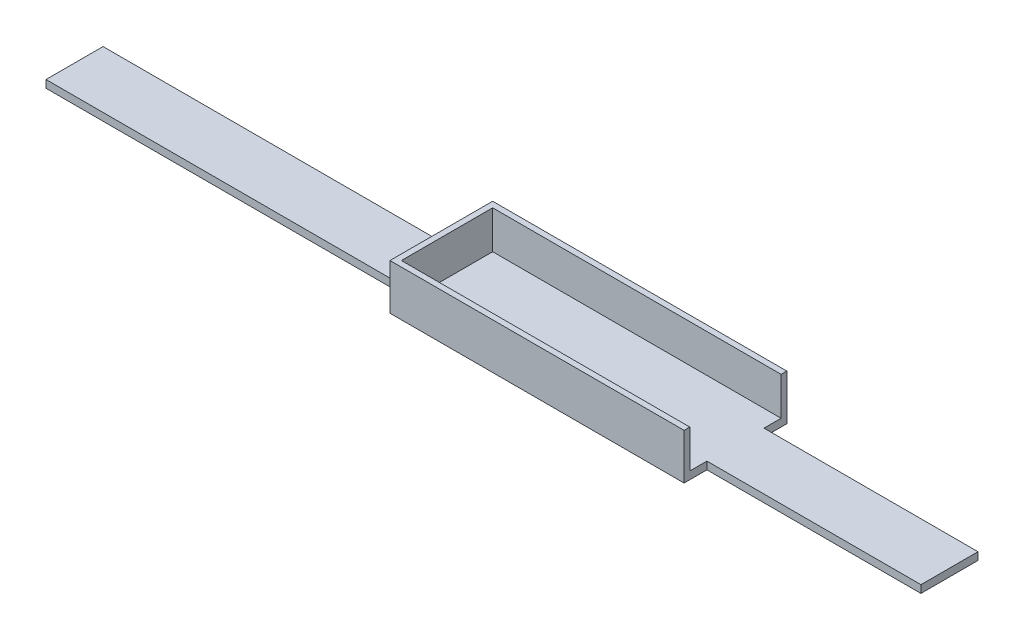
ISO-10303-21;
HEADER;
FILE_DESCRIPTION(('STEP AP214'),'2;1');
FILE_NAME('part.step','',(''),(''),'','','');
FILE_SCHEMA(('AUTOMOTIVE_DESIGN { 1 0 10303 214 1 1 1 1 }'));
ENDSEC;
DATA;
#1=APPLICATION_CONTEXT('core data for automotive mechanical design processes');
#2=APPLICATION_PROTOCOL_DEFINITION('international standard','automotive_design',2000,#1);
#3=PRODUCT_CONTEXT('',#1,'mechanical');
#4=PRODUCT('Part','Part','',(#3));
#5=PRODUCT_RELATED_PRODUCT_CATEGORY('part','',(#4));
#6=PRODUCT_DEFINITION_FORMATION('','',#4);
#7=PRODUCT_DEFINITION_CONTEXT('part definition',#1,'design');
#8=PRODUCT_DEFINITION('design','',#6,#7);
#9=PRODUCT_DEFINITION_SHAPE('','',#8);
#10=(LENGTH_UNIT() NAMED_UNIT(*) SI_UNIT(.MILLI.,.METRE.));
#11=(NAMED_UNIT(*) PLANE_ANGLE_UNIT() SI_UNIT($,.RADIAN.));
#12=(NAMED_UNIT(*) SI_UNIT($,.STERADIAN.) SOLID_ANGLE_UNIT());
#13=UNCERTAINTY_MEASURE_WITH_UNIT(LENGTH_MEASURE(1.E-05),#10,'distance_accuracy_value','');
#14=(GEOMETRIC_REPRESENTATION_CONTEXT(3) GLOBAL_UNCERTAINTY_ASSIGNED_CONTEXT((#13)) GLOBAL_UNIT_ASSIGNED_CONTEXT((#10,
#11,#12)) REPRESENTATION_CONTEXT('',''));
#15=CARTESIAN_POINT('',(0.,0.,0.));
#16=DIRECTION('',(0.,0.,1.));
#17=DIRECTION('',(1.,0.,0.));
#18=AXIS2_PLACEMENT_3D('',#15,#16,#17);
#19=CARTESIAN_POINT('',(0.,2.,0.));
#20=DIRECTION('',(0.,1.,0.));
#21=DIRECTION('',(0.,0.,1.));
#22=AXIS2_PLACEMENT_3D('',#19,#20,#21);
#23=PLANE('',#22);
#24=DIRECTION('',(1.,0.,0.));
#25=VECTOR('',#24,1.);
#26=CARTESIAN_POINT('',(-115.,2.,2.75224215246635));
#27=LINE('',#26,#25);
#28=CARTESIAN_POINT('',(-115.,2.,2.75224215246635));
#29=VERTEX_POINT('',#28);
#30=CARTESIAN_POINT('',(-18.5823533598814,2.,2.75224215246639));
#31=VERTEX_POINT('',#30);
#32=EDGE_CURVE('E174',#29,#31,#27,.T.);
#33=ORIENTED_EDGE('',*,*,#32,.T.);
#34=DIRECTION('',(0.,0.,1.));
#35=VECTOR('',#34,1.);
#36=CARTESIAN_POINT('',(-18.5823533598814,2.,-18.2477578475336));
#37=LINE('',#36,#35);
#38=CARTESIAN_POINT('',(-18.5823533598814,2.,-12.2477578475336));
#39=VERTEX_POINT('',#38);
#40=EDGE_CURVE('E256',#39,#31,#37,.T.);
#41=ORIENTED_EDGE('',*,*,#40,.F.);
#42=DIRECTION('',(-1.,0.,0.));
#43=VECTOR('',#42,1.);
#44=CARTESIAN_POINT('',(-115.,2.,-12.2477578475336));
#45=LINE('',#44,#43);
#46=CARTESIAN_POINT('',(-115.,2.,-12.2477578475336));
#47=VERTEX_POINT('',#46);
#48=EDGE_CURVE('E186',#39,#47,#45,.T.);
#49=ORIENTED_EDGE('',*,*,#48,.T.);
#50=DIRECTION('',(0.,0.,1.));
#51=VECTOR('',#50,1.);
#52=CARTESIAN_POINT('',(-115.,2.,-12.2477578475336));
#53=LINE('',#52,#51);
#54=EDGE_CURVE('E197',#47,#29,#53,.T.);
#55=ORIENTED_EDGE('',*,*,#54,.T.);
#56=EDGE_LOOP('',(#33,#41,#49,#55));
#57=FACE_BOUND('',#56,.T.);
#58=ADVANCED_FACE('F39',(#57),#23,.T.);
#59=DIRECTION('',(0.,0.,-1.));
#60=VECTOR('',#59,1.);
#61=CARTESIAN_POINT('',(-17.0823533598814,2.,7.25224215246636));
#62=LINE('',#61,#60);
#63=CARTESIAN_POINT('',(-17.0823533598814,2.,7.25224215246636));
#64=VERTEX_POINT('',#63);
#65=CARTESIAN_POINT('',(-17.0823533598814,2.,-16.7477578475336));
#66=VERTEX_POINT('',#65);
#67=EDGE_CURVE('E259',#64,#66,#62,.T.);
#68=ORIENTED_EDGE('',*,*,#67,.F.);
#69=DIRECTION('',(-1.,0.,0.));
#70=VECTOR('',#69,1.);
#71=CARTESIAN_POINT('',(58.7427130834762,2.,7.25224215246635));
#72=LINE('',#71,#70);
#73=CARTESIAN_POINT('',(58.7427130834762,2.,7.25224215246635));
#74=VERTEX_POINT('',#73);
#75=EDGE_CURVE('E257',#74,#64,#72,.T.);
#76=ORIENTED_EDGE('',*,*,#75,.F.);
#77=DIRECTION('',(0.,0.,-1.));
#78=VECTOR('',#77,1.);
#79=CARTESIAN_POINT('',(58.7427130834762,2.,92.1031691053456));
#80=LINE('',#79,#78);
#81=CARTESIAN_POINT('',(58.7427130834762,2.,2.75224215246639));
#82=VERTEX_POINT('',#81);
#83=EDGE_CURVE('E233',#74,#82,#80,.T.);
#84=ORIENTED_EDGE('',*,*,#83,.T.);
#85=CARTESIAN_POINT('',(115.,2.,2.75224215246635));
#86=VERTEX_POINT('',#85);
#87=EDGE_CURVE('E193',#82,#86,#27,.T.);
#88=ORIENTED_EDGE('',*,*,#87,.T.);
#89=DIRECTION('',(0.,0.,-1.));
#90=VECTOR('',#89,1.);
#91=CARTESIAN_POINT('',(115.,2.,-12.2477578475336));
#92=LINE('',#91,#90);
#93=CARTESIAN_POINT('',(115.,2.,-12.2477578475336));
#94=VERTEX_POINT('',#93);
#95=EDGE_CURVE('E183',#86,#94,#92,.T.);
#96=ORIENTED_EDGE('',*,*,#95,.T.);
#97=CARTESIAN_POINT('',(58.7427130834762,2.,-12.2477578475336));
#98=VERTEX_POINT('',#97);
#99=EDGE_CURVE('E251',#94,#98,#45,.T.);
#100=ORIENTED_EDGE('',*,*,#99,.T.);
#101=CARTESIAN_POINT('',(58.7427130834762,2.,-16.7477578475336));
#102=VERTEX_POINT('',#101);
#103=EDGE_CURVE('E54',#98,#102,#80,.T.);
#104=ORIENTED_EDGE('',*,*,#103,.T.);
#105=DIRECTION('',(1.,0.,0.));
#106=VECTOR('',#105,1.);
#107=CARTESIAN_POINT('',(-17.0823533598814,2.,-16.7477578475336));
#108=LINE('',#107,#106);
#109=EDGE_CURVE('E266',#66,#102,#108,.T.);
#110=ORIENTED_EDGE('',*,*,#109,.F.);
#111=EDGE_LOOP('',(#68,#76,#84,#88,#96,#100,#104,#110));
#112=FACE_BOUND('',#111,.T.);
#113=ADVANCED_FACE('F288',(#112),#23,.T.);
#114=CARTESIAN_POINT('',(-115.,2.,-12.2477578475336));
#115=DIRECTION('',(0.,0.,1.));
#116=DIRECTION('',(1.,0.,0.));
#117=AXIS2_PLACEMENT_3D('',#114,#115,#116);
#118=PLANE('',#117);
#119=ORIENTED_EDGE('',*,*,#48,.F.);
#120=DIRECTION('',(0.,-1.,0.));
#121=VECTOR('',#120,1.);
#122=CARTESIAN_POINT('',(-18.5823533598814,2.,-12.2477578475336));
#123=LINE('',#122,#121);
#124=CARTESIAN_POINT('',(-18.5823533598814,0.,-12.2477578475336));
#125=VERTEX_POINT('',#124);
#126=EDGE_CURVE('E203',#39,#125,#123,.T.);
#127=ORIENTED_EDGE('',*,*,#126,.T.);
#128=DIRECTION('',(-1.,0.,0.));
#129=VECTOR('',#128,1.);
#130=CARTESIAN_POINT('',(-115.,0.,-12.2477578475336));
#131=LINE('',#130,#129);
#132=CARTESIAN_POINT('',(-115.,0.,-12.2477578475336));
#133=VERTEX_POINT('',#132);
#134=EDGE_CURVE('E202',#125,#133,#131,.T.);
#135=ORIENTED_EDGE('',*,*,#134,.T.);
#136=DIRECTION('',(0.,-1.,0.));
#137=VECTOR('',#136,1.);
#138=CARTESIAN_POINT('',(-115.,2.,-12.2477578475336));
#139=LINE('',#138,#137);
#140=EDGE_CURVE('E47',#47,#133,#139,.T.);
#141=ORIENTED_EDGE('',*,*,#140,.F.);
#142=EDGE_LOOP('',(#119,#127,#135,#141));
#143=FACE_BOUND('',#142,.T.);
#144=ADVANCED_FACE('F210',(#143),#118,.F.);
#145=CARTESIAN_POINT('',(-115.,2.,2.75224215246635));
#146=DIRECTION('',(0.,0.,-1.));
#147=DIRECTION('',(-1.,0.,0.));
#148=AXIS2_PLACEMENT_3D('',#145,#146,#147);
#149=PLANE('',#148);
#150=DIRECTION('',(1.,0.,0.));
#151=VECTOR('',#150,1.);
#152=CARTESIAN_POINT('',(-115.,0.,2.75224215246635));
#153=LINE('',#152,#151);
#154=CARTESIAN_POINT('',(-115.,0.,2.75224215246635));
#155=VERTEX_POINT('',#154);
#156=CARTESIAN_POINT('',(-18.5823533598814,0.,2.75224215246639));
#157=VERTEX_POINT('',#156);
#158=EDGE_CURVE('E172',#155,#157,#153,.T.);
#159=ORIENTED_EDGE('',*,*,#158,.T.);
#160=DIRECTION('',(0.,1.,0.));
#161=VECTOR('',#160,1.);
#162=CARTESIAN_POINT('',(-18.5823533598814,2.,2.75224215246635));
#163=LINE('',#162,#161);
#164=EDGE_CURVE('E249',#157,#31,#163,.T.);
#165=ORIENTED_EDGE('',*,*,#164,.T.);
#166=ORIENTED_EDGE('',*,*,#32,.F.);
#167=DIRECTION('',(0.,-1.,0.));
#168=VECTOR('',#167,1.);
#169=CARTESIAN_POINT('',(-115.,2.,2.75224215246635));
#170=LINE('',#169,#168);
#171=EDGE_CURVE('E157',#29,#155,#170,.T.);
#172=ORIENTED_EDGE('',*,*,#171,.T.);
#173=EDGE_LOOP('',(#159,#165,#166,#172));
#174=FACE_BOUND('',#173,.T.);
#175=ADVANCED_FACE('F170',(#174),#149,.F.);
#176=CARTESIAN_POINT('',(115.,0.,-12.2477578475336));
#177=VERTEX_POINT('',#176);
#178=CARTESIAN_POINT('',(58.7427130834761,0.,-12.2477578475336));
#179=VERTEX_POINT('',#178);
#180=EDGE_CURVE('E165',#177,#179,#131,.T.);
#181=ORIENTED_EDGE('',*,*,#180,.T.);
#182=DIRECTION('',(0.,1.,0.));
#183=VECTOR('',#182,1.);
#184=CARTESIAN_POINT('',(58.7427130834762,1.9999999999994,-12.2477578475336));
#185=LINE('',#184,#183);
#186=EDGE_CURVE('E247',#179,#98,#185,.T.);
#187=ORIENTED_EDGE('',*,*,#186,.T.);
#188=ORIENTED_EDGE('',*,*,#99,.F.);
#189=DIRECTION('',(0.,-1.,0.));
#190=VECTOR('',#189,1.);
#191=CARTESIAN_POINT('',(115.,2.,-12.2477578475336));
#192=LINE('',#191,#190);
#193=EDGE_CURVE('E12',#94,#177,#192,.T.);
#194=ORIENTED_EDGE('',*,*,#193,.T.);
#195=EDGE_LOOP('',(#181,#187,#188,#194));
#196=FACE_BOUND('',#195,.T.);
#197=ADVANCED_FACE('F41',(#196),#118,.F.);
#198=ORIENTED_EDGE('',*,*,#87,.F.);
#199=DIRECTION('',(0.,-1.,0.));
#200=VECTOR('',#199,1.);
#201=CARTESIAN_POINT('',(58.7427130834762,1.9999999999994,2.75224215246635));
#202=LINE('',#201,#200);
#203=CARTESIAN_POINT('',(58.7427130834762,0.,2.75224215246635));
#204=VERTEX_POINT('',#203);
#205=EDGE_CURVE('E245',#82,#204,#202,.T.);
#206=ORIENTED_EDGE('',*,*,#205,.T.);
#207=CARTESIAN_POINT('',(115.,0.,2.75224215246635));
#208=VERTEX_POINT('',#207);
#209=EDGE_CURVE('E164',#204,#208,#153,.T.);
#210=ORIENTED_EDGE('',*,*,#209,.T.);
#211=DIRECTION('',(0.,-1.,0.));
#212=VECTOR('',#211,1.);
#213=CARTESIAN_POINT('',(115.,2.,2.75224215246635));
#214=LINE('',#213,#212);
#215=EDGE_CURVE('E175',#86,#208,#214,.T.);
#216=ORIENTED_EDGE('',*,*,#215,.F.);
#217=EDGE_LOOP('',(#198,#206,#210,#216));
#218=FACE_BOUND('',#217,.T.);
#219=ADVANCED_FACE('F293',(#218),#149,.F.);
#220=CARTESIAN_POINT('',(0.,0.,0.));
#221=DIRECTION('',(0.,1.,0.));
#222=DIRECTION('',(0.,0.,1.));
#223=AXIS2_PLACEMENT_3D('',#220,#221,#222);
#224=PLANE('',#223);
#225=ORIENTED_EDGE('',*,*,#209,.F.);
#226=DIRECTION('',(0.,0.,-1.));
#227=VECTOR('',#226,1.);
#228=CARTESIAN_POINT('',(58.7427130834761,0.,92.1031691053456));
#229=LINE('',#228,#227);
#230=CARTESIAN_POINT('',(58.7427130834761,0.,8.75224215246638));
#231=VERTEX_POINT('',#230);
#232=EDGE_CURVE('E62',#231,#204,#229,.T.);
#233=ORIENTED_EDGE('',*,*,#232,.F.);
#234=DIRECTION('',(1.,0.,0.));
#235=VECTOR('',#234,1.);
#236=CARTESIAN_POINT('',(-18.5823533598814,0.,8.75224215246635));
#237=LINE('',#236,#235);
#238=CARTESIAN_POINT('',(-18.5823533598814,0.,8.75224215246635));
#239=VERTEX_POINT('',#238);
#240=EDGE_CURVE('E237',#239,#231,#237,.T.);
#241=ORIENTED_EDGE('',*,*,#240,.F.);
#242=DIRECTION('',(0.,0.,-1.));
#243=VECTOR('',#242,1.);
#244=CARTESIAN_POINT('',(-18.5823533598814,0.,92.1031691053456));
#245=LINE('',#244,#243);
#246=EDGE_CURVE('E182',#239,#157,#245,.T.);
#247=ORIENTED_EDGE('',*,*,#246,.T.);
#248=ORIENTED_EDGE('',*,*,#158,.F.);
#249=DIRECTION('',(0.,0.,1.));
#250=VECTOR('',#249,1.);
#251=CARTESIAN_POINT('',(-115.,0.,-12.2477578475336));
#252=LINE('',#251,#250);
#253=EDGE_CURVE('E154',#133,#155,#252,.T.);
#254=ORIENTED_EDGE('',*,*,#253,.F.);
#255=ORIENTED_EDGE('',*,*,#134,.F.);
#256=CARTESIAN_POINT('',(-18.5823533598814,0.,-18.2477578475336));
#257=VERTEX_POINT('',#256);
#258=EDGE_CURVE('E213',#125,#257,#245,.T.);
#259=ORIENTED_EDGE('',*,*,#258,.T.);
#260=DIRECTION('',(-1.,0.,0.));
#261=VECTOR('',#260,1.);
#262=CARTESIAN_POINT('',(-18.5823533598814,0.,-18.2477578475336));
#263=LINE('',#262,#261);
#264=CARTESIAN_POINT('',(58.7427130834761,0.,-18.2477578475336));
#265=VERTEX_POINT('',#264);
#266=EDGE_CURVE('E216',#265,#257,#263,.T.);
#267=ORIENTED_EDGE('',*,*,#266,.F.);
#268=EDGE_CURVE('E242',#179,#265,#229,.T.);
#269=ORIENTED_EDGE('',*,*,#268,.F.);
#270=ORIENTED_EDGE('',*,*,#180,.F.);
#271=DIRECTION('',(0.,0.,-1.));
#272=VECTOR('',#271,1.);
#273=CARTESIAN_POINT('',(115.,0.,-12.2477578475336));
#274=LINE('',#273,#272);
#275=EDGE_CURVE('E201',#208,#177,#274,.T.);
#276=ORIENTED_EDGE('',*,*,#275,.F.);
#277=EDGE_LOOP('',(#225,#233,#241,#247,#248,#254,#255,#259,#267,#269,#270,#276));
#278=FACE_BOUND('',#277,.T.);
#279=ADVANCED_FACE('F179',(#278),#224,.F.);
#280=CARTESIAN_POINT('',(-115.,2.,8.75224215246635));
#281=DIRECTION('',(0.,0.,-1.));
#282=DIRECTION('',(-1.,0.,0.));
#283=AXIS2_PLACEMENT_3D('',#280,#281,#282);
#284=PLANE('',#283);
#285=DIRECTION('',(0.,1.,0.));
#286=VECTOR('',#285,1.);
#287=CARTESIAN_POINT('',(58.7427130834761,0.,8.75224215246635));
#288=LINE('',#287,#286);
#289=CARTESIAN_POINT('',(58.7427130834762,12.,8.75224215246635));
#290=VERTEX_POINT('',#289);
#291=EDGE_CURVE('E240',#231,#290,#288,.T.);
#292=ORIENTED_EDGE('',*,*,#291,.T.);
#293=DIRECTION('',(1.,0.,0.));
#294=VECTOR('',#293,1.);
#295=CARTESIAN_POINT('',(-18.5823533598814,12.,8.75224215246635));
#296=LINE('',#295,#294);
#297=CARTESIAN_POINT('',(-18.5823533598814,12.,8.75224215246635));
#298=VERTEX_POINT('',#297);
#299=EDGE_CURVE('E302',#298,#290,#296,.T.);
#300=ORIENTED_EDGE('',*,*,#299,.F.);
#301=DIRECTION('',(0.,-1.,0.));
#302=VECTOR('',#301,1.);
#303=CARTESIAN_POINT('',(-18.5823533598814,2.,8.75224215246635));
#304=LINE('',#303,#302);
#305=EDGE_CURVE('E239',#298,#239,#304,.T.);
#306=ORIENTED_EDGE('',*,*,#305,.T.);
#307=ORIENTED_EDGE('',*,*,#240,.T.);
#308=EDGE_LOOP('',(#292,#300,#306,#307));
#309=FACE_BOUND('',#308,.T.);
#310=ADVANCED_FACE('F301',(#309),#284,.F.);
#311=CARTESIAN_POINT('',(58.7427130834761,0.,92.1031691053456));
#312=DIRECTION('',(1.,0.,0.));
#313=DIRECTION('',(0.,1.,0.));
#314=AXIS2_PLACEMENT_3D('',#311,#312,#313);
#315=PLANE('',#314);
#316=ORIENTED_EDGE('',*,*,#205,.F.);
#317=ORIENTED_EDGE('',*,*,#83,.F.);
#318=DIRECTION('',(0.,-1.,0.));
#319=VECTOR('',#318,1.);
#320=CARTESIAN_POINT('',(58.7427130834762,12.,7.25224215246635));
#321=LINE('',#320,#319);
#322=CARTESIAN_POINT('',(58.7427130834762,12.,7.25224215246635));
#323=VERTEX_POINT('',#322);
#324=EDGE_CURVE('E277',#323,#74,#321,.T.);
#325=ORIENTED_EDGE('',*,*,#324,.F.);
#326=DIRECTION('',(0.,0.,-1.));
#327=VECTOR('',#326,1.);
#328=CARTESIAN_POINT('',(58.7427130834762,12.,8.75224215246635));
#329=LINE('',#328,#327);
#330=EDGE_CURVE('E297',#290,#323,#329,.T.);
#331=ORIENTED_EDGE('',*,*,#330,.F.);
#332=ORIENTED_EDGE('',*,*,#291,.F.);
#333=ORIENTED_EDGE('',*,*,#232,.T.);
#334=EDGE_LOOP('',(#316,#317,#325,#331,#332,#333));
#335=FACE_BOUND('',#334,.T.);
#336=ADVANCED_FACE('F290',(#335),#315,.T.);
#337=CARTESIAN_POINT('',(-18.5823533598814,2.,92.1031691053456));
#338=DIRECTION('',(-1.,0.,0.));
#339=DIRECTION('',(0.,0.,1.));
#340=AXIS2_PLACEMENT_3D('',#337,#338,#339);
#341=PLANE('',#340);
#342=ORIENTED_EDGE('',*,*,#126,.F.);
#343=ORIENTED_EDGE('',*,*,#40,.T.);
#344=ORIENTED_EDGE('',*,*,#164,.F.);
#345=ORIENTED_EDGE('',*,*,#246,.F.);
#346=ORIENTED_EDGE('',*,*,#305,.F.);
#347=DIRECTION('',(0.,0.,1.));
#348=VECTOR('',#347,1.);
#349=CARTESIAN_POINT('',(-18.5823533598814,12.,-18.2477578475336));
#350=LINE('',#349,#348);
#351=CARTESIAN_POINT('',(-18.5823533598814,12.,-18.2477578475336));
#352=VERTEX_POINT('',#351);
#353=EDGE_CURVE('E230',#352,#298,#350,.T.);
#354=ORIENTED_EDGE('',*,*,#353,.F.);
#355=DIRECTION('',(0.,1.,0.));
#356=VECTOR('',#355,1.);
#357=CARTESIAN_POINT('',(-18.5823533598814,2.,-18.2477578475336));
#358=LINE('',#357,#356);
#359=EDGE_CURVE('E224',#257,#352,#358,.T.);
#360=ORIENTED_EDGE('',*,*,#359,.F.);
#361=ORIENTED_EDGE('',*,*,#258,.F.);
#362=EDGE_LOOP('',(#342,#343,#344,#345,#346,#354,#360,#361));
#363=FACE_BOUND('',#362,.T.);
#364=ADVANCED_FACE('F228',(#363),#341,.T.);
#365=ORIENTED_EDGE('',*,*,#186,.F.);
#366=ORIENTED_EDGE('',*,*,#268,.T.);
#367=DIRECTION('',(0.,-1.,0.));
#368=VECTOR('',#367,1.);
#369=CARTESIAN_POINT('',(58.7427130834761,0.,-18.2477578475336));
#370=LINE('',#369,#368);
#371=CARTESIAN_POINT('',(58.7427130834762,12.,-18.2477578475336));
#372=VERTEX_POINT('',#371);
#373=EDGE_CURVE('E226',#372,#265,#370,.T.);
#374=ORIENTED_EDGE('',*,*,#373,.F.);
#375=DIRECTION('',(0.,0.,-1.));
#376=VECTOR('',#375,1.);
#377=CARTESIAN_POINT('',(58.7427130834762,12.,-16.7477578475336));
#378=LINE('',#377,#376);
#379=CARTESIAN_POINT('',(58.7427130834762,12.,-16.7477578475336));
#380=VERTEX_POINT('',#379);
#381=EDGE_CURVE('E262',#380,#372,#378,.T.);
#382=ORIENTED_EDGE('',*,*,#381,.F.);
#383=DIRECTION('',(0.,-1.,0.));
#384=VECTOR('',#383,1.);
#385=CARTESIAN_POINT('',(58.7427130834762,12.,-16.7477578475336));
#386=LINE('',#385,#384);
#387=EDGE_CURVE('E269',#380,#102,#386,.T.);
#388=ORIENTED_EDGE('',*,*,#387,.T.);
#389=ORIENTED_EDGE('',*,*,#103,.F.);
#390=EDGE_LOOP('',(#365,#366,#374,#382,#388,#389));
#391=FACE_BOUND('',#390,.T.);
#392=ADVANCED_FACE('F296',(#391),#315,.T.);
#393=CARTESIAN_POINT('',(0.,0.,-18.2477578475336));
#394=DIRECTION('',(0.,0.,1.));
#395=DIRECTION('',(1.,0.,0.));
#396=AXIS2_PLACEMENT_3D('',#393,#394,#395);
#397=PLANE('',#396);
#398=ORIENTED_EDGE('',*,*,#359,.T.);
#399=DIRECTION('',(-1.,0.,0.));
#400=VECTOR('',#399,1.);
#401=CARTESIAN_POINT('',(58.7427130834762,12.,-18.2477578475336));
#402=LINE('',#401,#400);
#403=EDGE_CURVE('E268',#372,#352,#402,.T.);
#404=ORIENTED_EDGE('',*,*,#403,.F.);
#405=ORIENTED_EDGE('',*,*,#373,.T.);
#406=ORIENTED_EDGE('',*,*,#266,.T.);
#407=EDGE_LOOP('',(#398,#404,#405,#406));
#408=FACE_BOUND('',#407,.T.);
#409=ADVANCED_FACE('F222',(#408),#397,.F.);
#410=CARTESIAN_POINT('',(58.7427130834762,12.,7.25224215246635));
#411=DIRECTION('',(0.,0.,1.));
#412=DIRECTION('',(1.,0.,0.));
#413=AXIS2_PLACEMENT_3D('',#410,#411,#412);
#414=PLANE('',#413);
#415=ORIENTED_EDGE('',*,*,#75,.T.);
#416=DIRECTION('',(0.,-1.,0.));
#417=VECTOR('',#416,1.);
#418=CARTESIAN_POINT('',(-17.0823533598814,12.,7.25224215246636));
#419=LINE('',#418,#417);
#420=CARTESIAN_POINT('',(-17.0823533598814,12.,7.25224215246636));
#421=VERTEX_POINT('',#420);
#422=EDGE_CURVE('E274',#421,#64,#419,.T.);
#423=ORIENTED_EDGE('',*,*,#422,.F.);
#424=DIRECTION('',(-1.,0.,0.));
#425=VECTOR('',#424,1.);
#426=CARTESIAN_POINT('',(58.7427130834762,12.,7.25224215246635));
#427=LINE('',#426,#425);
#428=EDGE_CURVE('E284',#323,#421,#427,.T.);
#429=ORIENTED_EDGE('',*,*,#428,.F.);
#430=ORIENTED_EDGE('',*,*,#324,.T.);
#431=EDGE_LOOP('',(#415,#423,#429,#430));
#432=FACE_BOUND('',#431,.T.);
#433=ADVANCED_FACE('F282',(#432),#414,.F.);
#434=CARTESIAN_POINT('',(-17.0823533598814,12.,7.25224215246636));
#435=DIRECTION('',(-1.,0.,0.));
#436=DIRECTION('',(0.,0.,1.));
#437=AXIS2_PLACEMENT_3D('',#434,#435,#436);
#438=PLANE('',#437);
#439=ORIENTED_EDGE('',*,*,#67,.T.);
#440=DIRECTION('',(0.,-1.,0.));
#441=VECTOR('',#440,1.);
#442=CARTESIAN_POINT('',(-17.0823533598814,12.,-16.7477578475336));
#443=LINE('',#442,#441);
#444=CARTESIAN_POINT('',(-17.0823533598814,12.,-16.7477578475336));
#445=VERTEX_POINT('',#444);
#446=EDGE_CURVE('E271',#445,#66,#443,.T.);
#447=ORIENTED_EDGE('',*,*,#446,.F.);
#448=DIRECTION('',(0.,0.,-1.));
#449=VECTOR('',#448,1.);
#450=CARTESIAN_POINT('',(-17.0823533598814,12.,7.25224215246636));
#451=LINE('',#450,#449);
#452=EDGE_CURVE('E311',#421,#445,#451,.T.);
#453=ORIENTED_EDGE('',*,*,#452,.F.);
#454=ORIENTED_EDGE('',*,*,#422,.T.);
#455=EDGE_LOOP('',(#439,#447,#453,#454));
#456=FACE_BOUND('',#455,.T.);
#457=ADVANCED_FACE('F322',(#456),#438,.F.);
#458=CARTESIAN_POINT('',(-17.0823533598814,12.,-16.7477578475336));
#459=DIRECTION('',(0.,0.,-1.));
#460=DIRECTION('',(-1.,0.,0.));
#461=AXIS2_PLACEMENT_3D('',#458,#459,#460);
#462=PLANE('',#461);
#463=ORIENTED_EDGE('',*,*,#109,.T.);
#464=ORIENTED_EDGE('',*,*,#387,.F.);
#465=DIRECTION('',(1.,0.,0.));
#466=VECTOR('',#465,1.);
#467=CARTESIAN_POINT('',(-17.0823533598814,12.,-16.7477578475336));
#468=LINE('',#467,#466);
#469=EDGE_CURVE('E312',#445,#380,#468,.T.);
#470=ORIENTED_EDGE('',*,*,#469,.F.);
#471=ORIENTED_EDGE('',*,*,#446,.T.);
#472=EDGE_LOOP('',(#463,#464,#470,#471));
#473=FACE_BOUND('',#472,.T.);
#474=ADVANCED_FACE('F318',(#473),#462,.F.);
#475=CARTESIAN_POINT('',(0.,12.,0.));
#476=DIRECTION('',(0.,1.,0.));
#477=DIRECTION('',(0.,0.,1.));
#478=AXIS2_PLACEMENT_3D('',#475,#476,#477);
#479=PLANE('',#478);
#480=ORIENTED_EDGE('',*,*,#403,.T.);
#481=ORIENTED_EDGE('',*,*,#353,.T.);
#482=ORIENTED_EDGE('',*,*,#299,.T.);
#483=ORIENTED_EDGE('',*,*,#330,.T.);
#484=ORIENTED_EDGE('',*,*,#428,.T.);
#485=ORIENTED_EDGE('',*,*,#452,.T.);
#486=ORIENTED_EDGE('',*,*,#469,.T.);
#487=ORIENTED_EDGE('',*,*,#381,.T.);
#488=EDGE_LOOP('',(#480,#481,#482,#483,#484,#485,#486,#487));
#489=FACE_BOUND('',#488,.T.);
#490=ADVANCED_FACE('F304',(#489),#479,.T.);
#491=CARTESIAN_POINT('',(115.,12.,-27.2487578475336));
#492=DIRECTION('',(-1.,0.,0.));
#493=DIRECTION('',(0.,0.,1.));
#494=AXIS2_PLACEMENT_3D('',#491,#492,#493);
#495=PLANE('',#494);
#496=ORIENTED_EDGE('',*,*,#95,.F.);
#497=ORIENTED_EDGE('',*,*,#215,.T.);
#498=ORIENTED_EDGE('',*,*,#275,.T.);
#499=ORIENTED_EDGE('',*,*,#193,.F.);
#500=EDGE_LOOP('',(#496,#497,#498,#499));
#501=FACE_BOUND('',#500,.T.);
#502=ADVANCED_FACE('F294',(#501),#495,.F.);
#503=CARTESIAN_POINT('',(-115.,12.,-27.2487578475336));
#504=DIRECTION('',(1.,0.,0.));
#505=DIRECTION('',(0.,0.,-1.));
#506=AXIS2_PLACEMENT_3D('',#503,#504,#505);
#507=PLANE('',#506);
#508=ORIENTED_EDGE('',*,*,#54,.F.);
#509=ORIENTED_EDGE('',*,*,#140,.T.);
#510=ORIENTED_EDGE('',*,*,#253,.T.);
#511=ORIENTED_EDGE('',*,*,#171,.F.);
#512=EDGE_LOOP('',(#508,#509,#510,#511));
#513=FACE_BOUND('',#512,.T.);
#514=ADVANCED_FACE('F156',(#513),#507,.F.);
#515=CLOSED_SHELL('',(#58,#113,#144,#175,#197,#219,#279,#310,#336,#364,#392,#409,#433,#457,#474,
#490,#502,#514));
#516=MANIFOLD_SOLID_BREP('B2',#515);
#517=ADVANCED_BREP_SHAPE_REPRESENTATION('',(#18,#516),#14);
#518=SHAPE_DEFINITION_REPRESENTATION(#9,#517);
ENDSEC;
END-ISO-10303-21;
